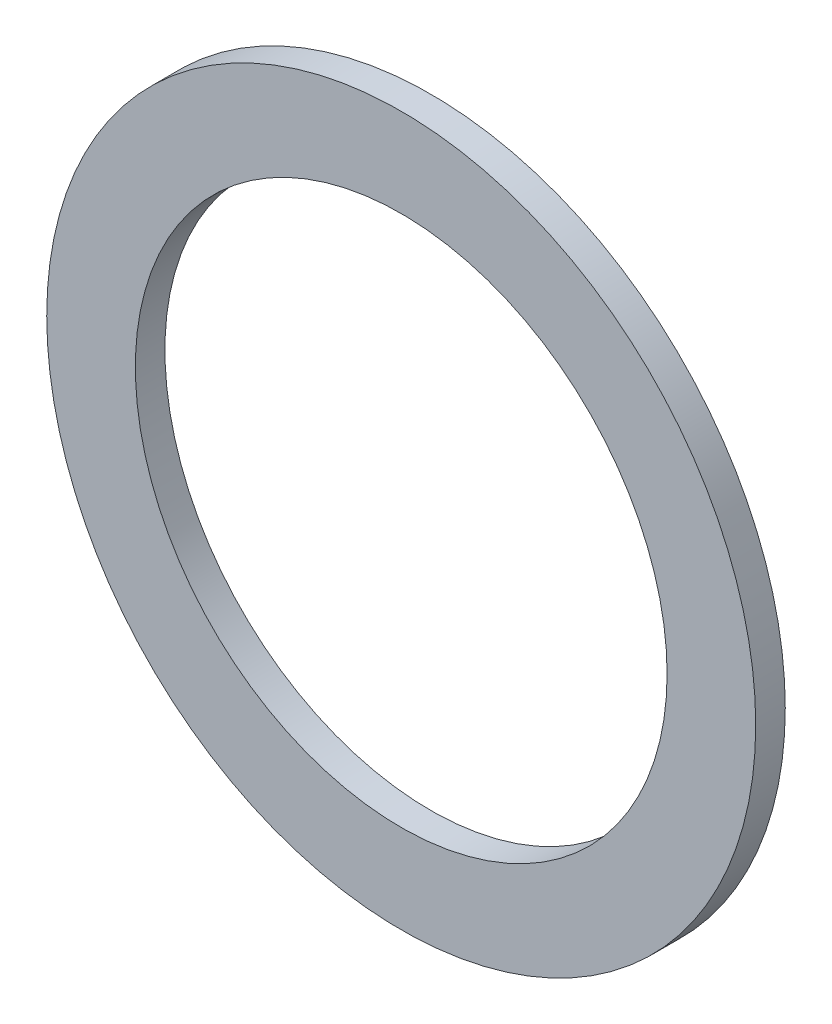
ISO-10303-21;
HEADER;
FILE_DESCRIPTION(('STEP AP214'),'2;1');
FILE_NAME('part.step','',(''),(''),'','','');
FILE_SCHEMA(('AUTOMOTIVE_DESIGN { 1 0 10303 214 1 1 1 1 }'));
ENDSEC;
DATA;
#1=APPLICATION_CONTEXT('core data for automotive mechanical design processes');
#2=APPLICATION_PROTOCOL_DEFINITION('international standard','automotive_design',2000,#1);
#3=PRODUCT_CONTEXT('',#1,'mechanical');
#4=PRODUCT('Part','Part','',(#3));
#5=PRODUCT_RELATED_PRODUCT_CATEGORY('part','',(#4));
#6=PRODUCT_DEFINITION_FORMATION('','',#4);
#7=PRODUCT_DEFINITION_CONTEXT('part definition',#1,'design');
#8=PRODUCT_DEFINITION('design','',#6,#7);
#9=PRODUCT_DEFINITION_SHAPE('','',#8);
#10=(LENGTH_UNIT() NAMED_UNIT(*) SI_UNIT(.MILLI.,.METRE.));
#11=(NAMED_UNIT(*) PLANE_ANGLE_UNIT() SI_UNIT($,.RADIAN.));
#12=(NAMED_UNIT(*) SI_UNIT($,.STERADIAN.) SOLID_ANGLE_UNIT());
#13=UNCERTAINTY_MEASURE_WITH_UNIT(LENGTH_MEASURE(1.E-05),#10,'distance_accuracy_value','');
#14=(GEOMETRIC_REPRESENTATION_CONTEXT(3) GLOBAL_UNCERTAINTY_ASSIGNED_CONTEXT((#13)) GLOBAL_UNIT_ASSIGNED_CONTEXT((#10,
#11,#12)) REPRESENTATION_CONTEXT('',''));
#15=CARTESIAN_POINT('',(0.,0.,0.));
#16=DIRECTION('',(0.,0.,1.));
#17=DIRECTION('',(1.,0.,0.));
#18=AXIS2_PLACEMENT_3D('',#15,#16,#17);
#19=CARTESIAN_POINT('',(0.,0.,1.));
#20=DIRECTION('',(0.,0.,1.));
#21=DIRECTION('',(1.,0.,0.));
#22=AXIS2_PLACEMENT_3D('',#19,#20,#21);
#23=PLANE('',#22);
#24=CARTESIAN_POINT('',(0.,0.,1.));
#25=DIRECTION('',(0.,0.,1.));
#26=DIRECTION('',(1.,0.,0.));
#27=AXIS2_PLACEMENT_3D('',#24,#25,#26);
#28=CIRCLE('',#27,12.);
#29=CARTESIAN_POINT('',(12.,0.,1.));
#30=VERTEX_POINT('',#29);
#31=EDGE_CURVE('E10',#30,#30,#28,.T.);
#32=ORIENTED_EDGE('',*,*,#31,.T.);
#33=EDGE_LOOP('',(#32));
#34=FACE_BOUND('',#33,.T.);
#35=CARTESIAN_POINT('',(0.,0.,1.));
#36=DIRECTION('',(0.,0.,1.));
#37=DIRECTION('',(1.,0.,0.));
#38=AXIS2_PLACEMENT_3D('',#35,#36,#37);
#39=CIRCLE('',#38,9.);
#40=CARTESIAN_POINT('',(9.,0.,1.));
#41=VERTEX_POINT('',#40);
#42=EDGE_CURVE('E50',#41,#41,#39,.T.);
#43=ORIENTED_EDGE('',*,*,#42,.F.);
#44=EDGE_LOOP('',(#43));
#45=FACE_BOUND('',#44,.T.);
#46=ADVANCED_FACE('F37',(#34,#45),#23,.T.);
#47=CARTESIAN_POINT('',(0.,0.,0.));
#48=DIRECTION('',(0.,0.,1.));
#49=DIRECTION('',(1.,0.,0.));
#50=AXIS2_PLACEMENT_3D('',#47,#48,#49);
#51=PLANE('',#50);
#52=CARTESIAN_POINT('',(0.,0.,0.));
#53=DIRECTION('',(0.,0.,1.));
#54=DIRECTION('',(1.,0.,0.));
#55=AXIS2_PLACEMENT_3D('',#52,#53,#54);
#56=CIRCLE('',#55,12.);
#57=CARTESIAN_POINT('',(12.,0.,0.));
#58=VERTEX_POINT('',#57);
#59=EDGE_CURVE('E41',#58,#58,#56,.T.);
#60=ORIENTED_EDGE('',*,*,#59,.F.);
#61=EDGE_LOOP('',(#60));
#62=FACE_BOUND('',#61,.T.);
#63=CARTESIAN_POINT('',(0.,0.,0.));
#64=DIRECTION('',(0.,0.,1.));
#65=DIRECTION('',(1.,0.,0.));
#66=AXIS2_PLACEMENT_3D('',#63,#64,#65);
#67=CIRCLE('',#66,9.);
#68=CARTESIAN_POINT('',(9.,0.,0.));
#69=VERTEX_POINT('',#68);
#70=EDGE_CURVE('E52',#69,#69,#67,.T.);
#71=ORIENTED_EDGE('',*,*,#70,.T.);
#72=EDGE_LOOP('',(#71));
#73=FACE_BOUND('',#72,.T.);
#74=ADVANCED_FACE('F64',(#62,#73),#51,.F.);
#75=CARTESIAN_POINT('',(0.,0.,1.));
#76=DIRECTION('',(0.,0.,-1.));
#77=DIRECTION('',(-1.,0.,0.));
#78=AXIS2_PLACEMENT_3D('',#75,#76,#77);
#79=CYLINDRICAL_SURFACE('',#78,12.);
#80=ORIENTED_EDGE('',*,*,#31,.F.);
#81=EDGE_LOOP('',(#80));
#82=FACE_BOUND('',#81,.T.);
#83=ORIENTED_EDGE('',*,*,#59,.T.);
#84=EDGE_LOOP('',(#83));
#85=FACE_BOUND('',#84,.T.);
#86=ADVANCED_FACE('F39',(#82,#85),#79,.T.);
#87=CARTESIAN_POINT('',(0.,0.,1.));
#88=DIRECTION('',(0.,0.,-1.));
#89=DIRECTION('',(-1.,0.,0.));
#90=AXIS2_PLACEMENT_3D('',#87,#88,#89);
#91=CYLINDRICAL_SURFACE('',#90,9.);
#92=ORIENTED_EDGE('',*,*,#42,.T.);
#93=EDGE_LOOP('',(#92));
#94=FACE_BOUND('',#93,.T.);
#95=ORIENTED_EDGE('',*,*,#70,.F.);
#96=EDGE_LOOP('',(#95));
#97=FACE_BOUND('',#96,.T.);
#98=ADVANCED_FACE('F60',(#94,#97),#91,.F.);
#99=CLOSED_SHELL('',(#46,#74,#86,#98));
#100=MANIFOLD_SOLID_BREP('B2',#99);
#101=ADVANCED_BREP_SHAPE_REPRESENTATION('',(#18,#100),#14);
#102=SHAPE_DEFINITION_REPRESENTATION(#9,#101);
ENDSEC;
END-ISO-10303-21;
